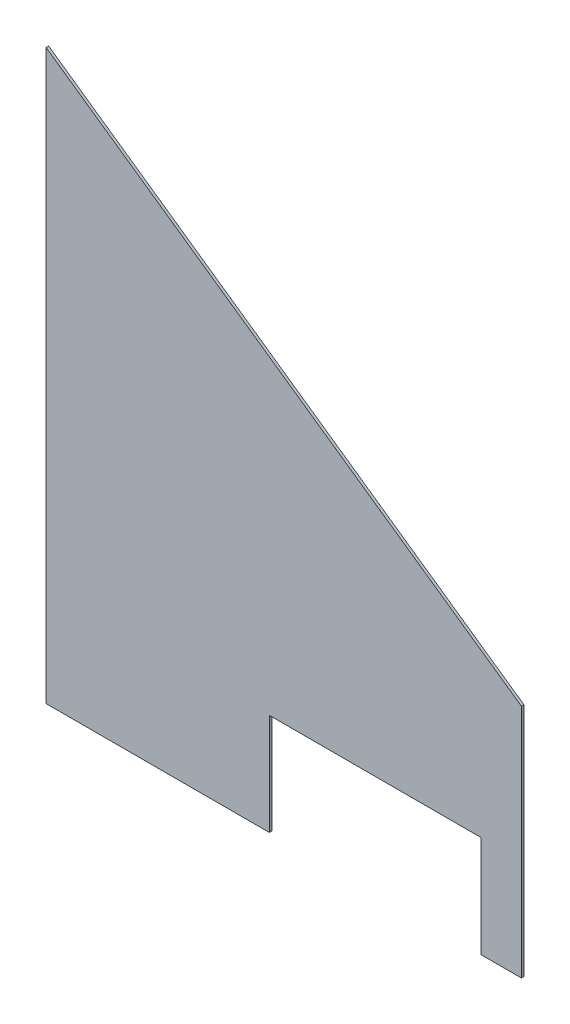
ISO-10303-21;
HEADER;
FILE_DESCRIPTION(('STEP AP214'),'2;1');
FILE_NAME('part.step','',(''),(''),'','','');
FILE_SCHEMA(('AUTOMOTIVE_DESIGN { 1 0 10303 214 1 1 1 1 }'));
ENDSEC;
DATA;
#1=APPLICATION_CONTEXT('core data for automotive mechanical design processes');
#2=APPLICATION_PROTOCOL_DEFINITION('international standard','automotive_design',2000,#1);
#3=PRODUCT_CONTEXT('',#1,'mechanical');
#4=PRODUCT('Part','Part','',(#3));
#5=PRODUCT_RELATED_PRODUCT_CATEGORY('part','',(#4));
#6=PRODUCT_DEFINITION_FORMATION('','',#4);
#7=PRODUCT_DEFINITION_CONTEXT('part definition',#1,'design');
#8=PRODUCT_DEFINITION('design','',#6,#7);
#9=PRODUCT_DEFINITION_SHAPE('','',#8);
#10=(LENGTH_UNIT() NAMED_UNIT(*) SI_UNIT(.MILLI.,.METRE.));
#11=(NAMED_UNIT(*) PLANE_ANGLE_UNIT() SI_UNIT($,.RADIAN.));
#12=(NAMED_UNIT(*) SI_UNIT($,.STERADIAN.) SOLID_ANGLE_UNIT());
#13=UNCERTAINTY_MEASURE_WITH_UNIT(LENGTH_MEASURE(1.E-05),#10,'distance_accuracy_value','');
#14=(GEOMETRIC_REPRESENTATION_CONTEXT(3) GLOBAL_UNCERTAINTY_ASSIGNED_CONTEXT((#13)) GLOBAL_UNIT_ASSIGNED_CONTEXT((#10,
#11,#12)) REPRESENTATION_CONTEXT('',''));
#15=CARTESIAN_POINT('',(0.,0.,0.));
#16=DIRECTION('',(0.,0.,1.));
#17=DIRECTION('',(1.,0.,0.));
#18=AXIS2_PLACEMENT_3D('',#15,#16,#17);
#19=CARTESIAN_POINT('',(-32.9156963859845,-20.5831759646458,3.175));
#20=DIRECTION('',(1.,0.,0.));
#21=DIRECTION('',(0.,1.,0.));
#22=AXIS2_PLACEMENT_3D('',#19,#20,#21);
#23=PLANE('',#22);
#24=DIRECTION('',(0.,-1.,0.));
#25=VECTOR('',#24,1.);
#26=CARTESIAN_POINT('',(-32.9156963859845,-20.5831759646458,0.));
#27=LINE('',#26,#25);
#28=CARTESIAN_POINT('',(-32.9156963859871,690.616824035354,0.));
#29=VERTEX_POINT('',#28);
#30=CARTESIAN_POINT('',(-32.9156963859845,-20.5831759646458,0.));
#31=VERTEX_POINT('',#30);
#32=EDGE_CURVE('E130',#29,#31,#27,.T.);
#33=ORIENTED_EDGE('',*,*,#32,.T.);
#34=DIRECTION('',(0.,0.,-1.));
#35=VECTOR('',#34,1.);
#36=CARTESIAN_POINT('',(-32.9156963859845,-20.5831759646458,3.175));
#37=LINE('',#36,#35);
#38=CARTESIAN_POINT('',(-32.9156963859845,-20.5831759646458,3.175));
#39=VERTEX_POINT('',#38);
#40=EDGE_CURVE('E11',#39,#31,#37,.T.);
#41=ORIENTED_EDGE('',*,*,#40,.F.);
#42=DIRECTION('',(0.,-1.,0.));
#43=VECTOR('',#42,1.);
#44=CARTESIAN_POINT('',(-32.9156963859845,-20.5831759646458,3.175));
#45=LINE('',#44,#43);
#46=CARTESIAN_POINT('',(-32.9156963859871,690.616824035354,3.175));
#47=VERTEX_POINT('',#46);
#48=EDGE_CURVE('E145',#47,#39,#45,.T.);
#49=ORIENTED_EDGE('',*,*,#48,.F.);
#50=DIRECTION('',(0.,0.,-1.));
#51=VECTOR('',#50,1.);
#52=CARTESIAN_POINT('',(-32.9156963859871,690.616824035354,3.175));
#53=LINE('',#52,#51);
#54=EDGE_CURVE('E126',#47,#29,#53,.T.);
#55=ORIENTED_EDGE('',*,*,#54,.T.);
#56=EDGE_LOOP('',(#33,#41,#49,#55));
#57=FACE_BOUND('',#56,.T.);
#58=ADVANCED_FACE('F33',(#57),#23,.F.);
#59=CARTESIAN_POINT('',(-32.9156963859845,-20.5831759646458,3.175));
#60=DIRECTION('',(0.,1.,0.));
#61=DIRECTION('',(0.,0.,1.));
#62=AXIS2_PLACEMENT_3D('',#59,#60,#61);
#63=PLANE('',#62);
#64=DIRECTION('',(1.,0.,0.));
#65=VECTOR('',#64,1.);
#66=CARTESIAN_POINT('',(-32.9156963859845,-20.5831759646458,0.));
#67=LINE('',#66,#65);
#68=CARTESIAN_POINT('',(246.484303614016,-20.5831759646458,0.));
#69=VERTEX_POINT('',#68);
#70=EDGE_CURVE('E133',#31,#69,#67,.T.);
#71=ORIENTED_EDGE('',*,*,#70,.T.);
#72=DIRECTION('',(0.,0.,-1.));
#73=VECTOR('',#72,1.);
#74=CARTESIAN_POINT('',(246.484303614016,-20.5831759646458,3.175));
#75=LINE('',#74,#73);
#76=CARTESIAN_POINT('',(246.484303614016,-20.5831759646458,3.175));
#77=VERTEX_POINT('',#76);
#78=EDGE_CURVE('E41',#77,#69,#75,.T.);
#79=ORIENTED_EDGE('',*,*,#78,.F.);
#80=DIRECTION('',(1.,0.,0.));
#81=VECTOR('',#80,1.);
#82=CARTESIAN_POINT('',(-32.9156963859845,-20.5831759646458,3.175));
#83=LINE('',#82,#81);
#84=EDGE_CURVE('E90',#39,#77,#83,.T.);
#85=ORIENTED_EDGE('',*,*,#84,.F.);
#86=ORIENTED_EDGE('',*,*,#40,.T.);
#87=EDGE_LOOP('',(#71,#79,#85,#86));
#88=FACE_BOUND('',#87,.T.);
#89=ADVANCED_FACE('F178',(#88),#63,.F.);
#90=CARTESIAN_POINT('',(246.484303614016,-20.5831759646458,3.175));
#91=DIRECTION('',(-1.,0.,0.));
#92=DIRECTION('',(0.,0.,1.));
#93=AXIS2_PLACEMENT_3D('',#90,#91,#92);
#94=PLANE('',#93);
#95=DIRECTION('',(0.,1.,0.));
#96=VECTOR('',#95,1.);
#97=CARTESIAN_POINT('',(246.484303614016,-20.5831759646458,0.));
#98=LINE('',#97,#96);
#99=CARTESIAN_POINT('',(246.484303614016,106.416824035354,0.));
#100=VERTEX_POINT('',#99);
#101=EDGE_CURVE('E135',#69,#100,#98,.T.);
#102=ORIENTED_EDGE('',*,*,#101,.T.);
#103=DIRECTION('',(0.,0.,-1.));
#104=VECTOR('',#103,1.);
#105=CARTESIAN_POINT('',(246.484303614016,106.416824035354,3.175));
#106=LINE('',#105,#104);
#107=CARTESIAN_POINT('',(246.484303614016,106.416824035354,3.175));
#108=VERTEX_POINT('',#107);
#109=EDGE_CURVE('E152',#108,#100,#106,.T.);
#110=ORIENTED_EDGE('',*,*,#109,.F.);
#111=DIRECTION('',(0.,1.,0.));
#112=VECTOR('',#111,1.);
#113=CARTESIAN_POINT('',(246.484303614016,-20.5831759646458,3.175));
#114=LINE('',#113,#112);
#115=EDGE_CURVE('E160',#77,#108,#114,.T.);
#116=ORIENTED_EDGE('',*,*,#115,.F.);
#117=ORIENTED_EDGE('',*,*,#78,.T.);
#118=EDGE_LOOP('',(#102,#110,#116,#117));
#119=FACE_BOUND('',#118,.T.);
#120=ADVANCED_FACE('F158',(#119),#94,.F.);
#121=CARTESIAN_POINT('',(246.484303614016,106.416824035354,3.175));
#122=DIRECTION('',(0.,1.,0.));
#123=DIRECTION('',(0.,0.,1.));
#124=AXIS2_PLACEMENT_3D('',#121,#122,#123);
#125=PLANE('',#124);
#126=DIRECTION('',(1.,0.,0.));
#127=VECTOR('',#126,1.);
#128=CARTESIAN_POINT('',(246.484303614016,106.416824035354,0.));
#129=LINE('',#128,#127);
#130=CARTESIAN_POINT('',(511.152303614016,106.416824035354,0.));
#131=VERTEX_POINT('',#130);
#132=EDGE_CURVE('E137',#100,#131,#129,.T.);
#133=ORIENTED_EDGE('',*,*,#132,.T.);
#134=DIRECTION('',(0.,0.,-1.));
#135=VECTOR('',#134,1.);
#136=CARTESIAN_POINT('',(511.152303614016,106.416824035354,3.175));
#137=LINE('',#136,#135);
#138=CARTESIAN_POINT('',(511.152303614016,106.416824035354,3.175));
#139=VERTEX_POINT('',#138);
#140=EDGE_CURVE('E149',#139,#131,#137,.T.);
#141=ORIENTED_EDGE('',*,*,#140,.F.);
#142=DIRECTION('',(1.,0.,0.));
#143=VECTOR('',#142,1.);
#144=CARTESIAN_POINT('',(246.484303614016,106.416824035354,3.175));
#145=LINE('',#144,#143);
#146=EDGE_CURVE('E170',#108,#139,#145,.T.);
#147=ORIENTED_EDGE('',*,*,#146,.F.);
#148=ORIENTED_EDGE('',*,*,#109,.T.);
#149=EDGE_LOOP('',(#133,#141,#147,#148));
#150=FACE_BOUND('',#149,.T.);
#151=ADVANCED_FACE('F166',(#150),#125,.F.);
#152=CARTESIAN_POINT('',(511.152303614016,106.416824035354,3.175));
#153=DIRECTION('',(1.,0.,0.));
#154=DIRECTION('',(0.,0.,-1.));
#155=AXIS2_PLACEMENT_3D('',#152,#153,#154);
#156=PLANE('',#155);
#157=DIRECTION('',(0.,-1.,0.));
#158=VECTOR('',#157,1.);
#159=CARTESIAN_POINT('',(511.152303614016,106.416824035354,0.));
#160=LINE('',#159,#158);
#161=CARTESIAN_POINT('',(511.152303614016,-20.5831759646458,0.));
#162=VERTEX_POINT('',#161);
#163=EDGE_CURVE('E139',#131,#162,#160,.T.);
#164=ORIENTED_EDGE('',*,*,#163,.T.);
#165=DIRECTION('',(0.,0.,-1.));
#166=VECTOR('',#165,1.);
#167=CARTESIAN_POINT('',(511.152303614016,-20.5831759646458,3.175));
#168=LINE('',#167,#166);
#169=CARTESIAN_POINT('',(511.152303614016,-20.5831759646458,3.175));
#170=VERTEX_POINT('',#169);
#171=EDGE_CURVE('E121',#170,#162,#168,.T.);
#172=ORIENTED_EDGE('',*,*,#171,.F.);
#173=DIRECTION('',(0.,-1.,0.));
#174=VECTOR('',#173,1.);
#175=CARTESIAN_POINT('',(511.152303614016,106.416824035354,3.175));
#176=LINE('',#175,#174);
#177=EDGE_CURVE('E110',#139,#170,#176,.T.);
#178=ORIENTED_EDGE('',*,*,#177,.F.);
#179=ORIENTED_EDGE('',*,*,#140,.T.);
#180=EDGE_LOOP('',(#164,#172,#178,#179));
#181=FACE_BOUND('',#180,.T.);
#182=ADVANCED_FACE('F169',(#181),#156,.F.);
#183=CARTESIAN_POINT('',(511.152303614016,-20.5831759646458,3.175));
#184=DIRECTION('',(0.,1.,0.));
#185=DIRECTION('',(-1.,0.,0.));
#186=AXIS2_PLACEMENT_3D('',#183,#184,#185);
#187=PLANE('',#186);
#188=DIRECTION('',(1.,0.,0.));
#189=VECTOR('',#188,1.);
#190=CARTESIAN_POINT('',(511.152303614016,-20.5831759646458,0.));
#191=LINE('',#190,#189);
#192=CARTESIAN_POINT('',(561.952303614016,-20.5831759646458,0.));
#193=VERTEX_POINT('',#192);
#194=EDGE_CURVE('E119',#162,#193,#191,.T.);
#195=ORIENTED_EDGE('',*,*,#194,.T.);
#196=DIRECTION('',(0.,0.,-1.));
#197=VECTOR('',#196,1.);
#198=CARTESIAN_POINT('',(561.952303614016,-20.5831759646458,3.175));
#199=LINE('',#198,#197);
#200=CARTESIAN_POINT('',(561.952303614016,-20.5831759646458,3.175));
#201=VERTEX_POINT('',#200);
#202=EDGE_CURVE('E116',#201,#193,#199,.T.);
#203=ORIENTED_EDGE('',*,*,#202,.F.);
#204=DIRECTION('',(1.,0.,0.));
#205=VECTOR('',#204,1.);
#206=CARTESIAN_POINT('',(511.152303614016,-20.5831759646458,3.175));
#207=LINE('',#206,#205);
#208=EDGE_CURVE('E103',#170,#201,#207,.T.);
#209=ORIENTED_EDGE('',*,*,#208,.F.);
#210=ORIENTED_EDGE('',*,*,#171,.T.);
#211=EDGE_LOOP('',(#195,#203,#209,#210));
#212=FACE_BOUND('',#211,.T.);
#213=ADVANCED_FACE('F117',(#212),#187,.F.);
#214=CARTESIAN_POINT('',(561.952303614016,274.085766195614,3.175));
#215=DIRECTION('',(-1.,0.,0.));
#216=DIRECTION('',(0.,0.,1.));
#217=AXIS2_PLACEMENT_3D('',#214,#215,#216);
#218=PLANE('',#217);
#219=DIRECTION('',(0.,1.,0.));
#220=VECTOR('',#219,1.);
#221=CARTESIAN_POINT('',(561.952303614016,274.085766195614,0.));
#222=LINE('',#221,#220);
#223=CARTESIAN_POINT('',(561.952303614016,274.085766195614,0.));
#224=VERTEX_POINT('',#223);
#225=EDGE_CURVE('E142',#193,#224,#222,.T.);
#226=ORIENTED_EDGE('',*,*,#225,.T.);
#227=DIRECTION('',(0.,0.,-1.));
#228=VECTOR('',#227,1.);
#229=CARTESIAN_POINT('',(561.952303614016,274.085766195614,3.175));
#230=LINE('',#229,#228);
#231=CARTESIAN_POINT('',(561.952303614016,274.085766195614,3.175));
#232=VERTEX_POINT('',#231);
#233=EDGE_CURVE('E122',#232,#224,#230,.T.);
#234=ORIENTED_EDGE('',*,*,#233,.F.);
#235=DIRECTION('',(0.,1.,0.));
#236=VECTOR('',#235,1.);
#237=CARTESIAN_POINT('',(561.952303614016,274.085766195614,3.175));
#238=LINE('',#237,#236);
#239=EDGE_CURVE('E107',#201,#232,#238,.T.);
#240=ORIENTED_EDGE('',*,*,#239,.F.);
#241=ORIENTED_EDGE('',*,*,#202,.T.);
#242=EDGE_LOOP('',(#226,#234,#240,#241));
#243=FACE_BOUND('',#242,.T.);
#244=ADVANCED_FACE('F124',(#243),#218,.F.);
#245=CARTESIAN_POINT('',(-32.9156963859871,690.616824035354,3.175));
#246=DIRECTION('',(-0.573576436351048,-0.81915204428899,0.));
#247=DIRECTION('',(0.819152044288991,-0.573576436351048,0.));
#248=AXIS2_PLACEMENT_3D('',#245,#246,#247);
#249=PLANE('',#248);
#250=DIRECTION('',(-0.81915204428899,0.573576436351048,0.));
#251=VECTOR('',#250,1.);
#252=CARTESIAN_POINT('',(-32.9156963859871,690.616824035354,0.));
#253=LINE('',#252,#251);
#254=EDGE_CURVE('E78',#224,#29,#253,.T.);
#255=ORIENTED_EDGE('',*,*,#254,.T.);
#256=ORIENTED_EDGE('',*,*,#54,.F.);
#257=DIRECTION('',(-0.81915204428898,0.573576436351062,0.));
#258=VECTOR('',#257,1.);
#259=CARTESIAN_POINT('',(473.230737731666,336.209275428208,3.175));
#260=LINE('',#259,#258);
#261=EDGE_CURVE('E49',#232,#47,#260,.T.);
#262=ORIENTED_EDGE('',*,*,#261,.F.);
#263=ORIENTED_EDGE('',*,*,#233,.T.);
#264=EDGE_LOOP('',(#255,#256,#262,#263));
#265=FACE_BOUND('',#264,.T.);
#266=ADVANCED_FACE('F194',(#265),#249,.F.);
#267=CARTESIAN_POINT('',(0.,0.,3.175));
#268=DIRECTION('',(0.,0.,-1.));
#269=DIRECTION('',(-1.,0.,0.));
#270=AXIS2_PLACEMENT_3D('',#267,#268,#269);
#271=PLANE('',#270);
#272=ORIENTED_EDGE('',*,*,#48,.T.);
#273=ORIENTED_EDGE('',*,*,#84,.T.);
#274=ORIENTED_EDGE('',*,*,#115,.T.);
#275=ORIENTED_EDGE('',*,*,#146,.T.);
#276=ORIENTED_EDGE('',*,*,#177,.T.);
#277=ORIENTED_EDGE('',*,*,#208,.T.);
#278=ORIENTED_EDGE('',*,*,#239,.T.);
#279=ORIENTED_EDGE('',*,*,#261,.T.);
#280=EDGE_LOOP('',(#272,#273,#274,#275,#276,#277,#278,#279));
#281=FACE_BOUND('',#280,.T.);
#282=ADVANCED_FACE('F105',(#281),#271,.F.);
#283=CARTESIAN_POINT('',(0.,0.,0.));
#284=DIRECTION('',(0.,0.,-1.));
#285=DIRECTION('',(-1.,0.,0.));
#286=AXIS2_PLACEMENT_3D('',#283,#284,#285);
#287=PLANE('',#286);
#288=ORIENTED_EDGE('',*,*,#32,.F.);
#289=ORIENTED_EDGE('',*,*,#254,.F.);
#290=ORIENTED_EDGE('',*,*,#225,.F.);
#291=ORIENTED_EDGE('',*,*,#194,.F.);
#292=ORIENTED_EDGE('',*,*,#163,.F.);
#293=ORIENTED_EDGE('',*,*,#132,.F.);
#294=ORIENTED_EDGE('',*,*,#101,.F.);
#295=ORIENTED_EDGE('',*,*,#70,.F.);
#296=EDGE_LOOP('',(#288,#289,#290,#291,#292,#293,#294,#295));
#297=FACE_BOUND('',#296,.T.);
#298=ADVANCED_FACE('F162',(#297),#287,.T.);
#299=CLOSED_SHELL('',(#58,#89,#120,#151,#182,#213,#244,#266,#282,#298));
#300=MANIFOLD_SOLID_BREP('B2',#299);
#301=ADVANCED_BREP_SHAPE_REPRESENTATION('',(#18,#300),#14);
#302=SHAPE_DEFINITION_REPRESENTATION(#9,#301);
ENDSEC;
END-ISO-10303-21;
